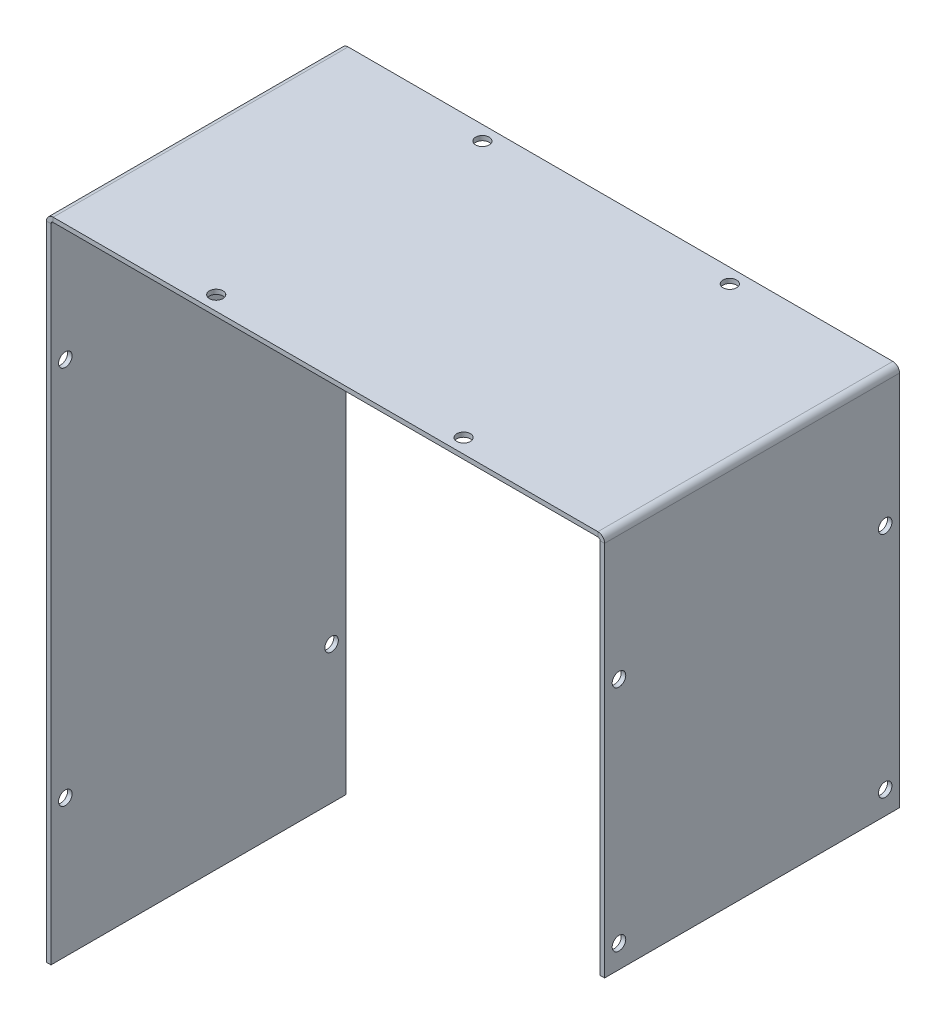
ISO-10303-21;
HEADER;
FILE_DESCRIPTION(('STEP AP214'),'2;1');
FILE_NAME('part.step','',(''),(''),'','','');
FILE_SCHEMA(('AUTOMOTIVE_DESIGN { 1 0 10303 214 1 1 1 1 }'));
ENDSEC;
DATA;
#1=APPLICATION_CONTEXT('core data for automotive mechanical design processes');
#2=APPLICATION_PROTOCOL_DEFINITION('international standard','automotive_design',2000,#1);
#3=PRODUCT_CONTEXT('',#1,'mechanical');
#4=PRODUCT('Part','Part','',(#3));
#5=PRODUCT_RELATED_PRODUCT_CATEGORY('part','',(#4));
#6=PRODUCT_DEFINITION_FORMATION('','',#4);
#7=PRODUCT_DEFINITION_CONTEXT('part definition',#1,'design');
#8=PRODUCT_DEFINITION('design','',#6,#7);
#9=PRODUCT_DEFINITION_SHAPE('','',#8);
#10=(LENGTH_UNIT() NAMED_UNIT(*) SI_UNIT(.MILLI.,.METRE.));
#11=(NAMED_UNIT(*) PLANE_ANGLE_UNIT() SI_UNIT($,.RADIAN.));
#12=(NAMED_UNIT(*) SI_UNIT($,.STERADIAN.) SOLID_ANGLE_UNIT());
#13=UNCERTAINTY_MEASURE_WITH_UNIT(LENGTH_MEASURE(1.E-05),#10,'distance_accuracy_value','');
#14=(GEOMETRIC_REPRESENTATION_CONTEXT(3) GLOBAL_UNCERTAINTY_ASSIGNED_CONTEXT((#13)) GLOBAL_UNIT_ASSIGNED_CONTEXT((#10,
#11,#12)) REPRESENTATION_CONTEXT('',''));
#15=CARTESIAN_POINT('',(0.,0.,0.));
#16=DIRECTION('',(0.,0.,1.));
#17=DIRECTION('',(1.,0.,0.));
#18=AXIS2_PLACEMENT_3D('',#15,#16,#17);
#19=CARTESIAN_POINT('',(-14.2238489831898,123.556300962878,91.5365107004053));
#20=DIRECTION('',(0.,0.,-1.));
#21=DIRECTION('',(0.,1.,0.));
#22=AXIS2_PLACEMENT_3D('',#19,#20,#21);
#23=PLANE('',#22);
#24=DIRECTION('',(0.,1.,0.));
#25=VECTOR('',#24,1.);
#26=CARTESIAN_POINT('',(167.03955101681,122.056300962877,91.5365107004056));
#27=LINE('',#26,#25);
#28=CARTESIAN_POINT('',(167.03955101681,122.056300962877,91.5365107004056));
#29=VERTEX_POINT('',#28);
#30=CARTESIAN_POINT('',(167.03955101681,123.556300962877,91.5365107004056));
#31=VERTEX_POINT('',#30);
#32=EDGE_CURVE('E163',#29,#31,#27,.T.);
#33=ORIENTED_EDGE('',*,*,#32,.T.);
#34=DIRECTION('',(1.,0.,0.));
#35=VECTOR('',#34,1.);
#36=CARTESIAN_POINT('',(-14.2238489831898,123.556300962878,91.5365107004053));
#37=LINE('',#36,#35);
#38=CARTESIAN_POINT('',(-13.4872489831898,123.556300962878,91.5365107004053));
#39=VERTEX_POINT('',#38);
#40=EDGE_CURVE('E40',#39,#31,#37,.T.);
#41=ORIENTED_EDGE('',*,*,#40,.F.);
#42=DIRECTION('',(0.,1.,0.));
#43=VECTOR('',#42,1.);
#44=CARTESIAN_POINT('',(-13.4872489831898,122.056300962877,91.5365107004052));
#45=LINE('',#44,#43);
#46=CARTESIAN_POINT('',(-13.4872489831898,122.056300962877,91.5365107004052));
#47=VERTEX_POINT('',#46);
#48=EDGE_CURVE('E224',#47,#39,#45,.T.);
#49=ORIENTED_EDGE('',*,*,#48,.F.);
#50=DIRECTION('',(1.,0.,0.));
#51=VECTOR('',#50,1.);
#52=CARTESIAN_POINT('',(-14.2238489831898,122.056300962878,91.5365107004053));
#53=LINE('',#52,#51);
#54=EDGE_CURVE('E226',#47,#29,#53,.T.);
#55=ORIENTED_EDGE('',*,*,#54,.T.);
#56=EDGE_LOOP('',(#33,#41,#49,#55));
#57=FACE_BOUND('',#56,.T.);
#58=ADVANCED_FACE('F32',(#57),#23,.F.);
#59=CARTESIAN_POINT('',(-14.2238489831898,123.556300962877,-6.22688929959475));
#60=DIRECTION('',(0.,0.,1.));
#61=DIRECTION('',(0.,-1.,0.));
#62=AXIS2_PLACEMENT_3D('',#59,#60,#61);
#63=PLANE('',#62);
#64=DIRECTION('',(0.,1.,0.));
#65=VECTOR('',#64,1.);
#66=CARTESIAN_POINT('',(167.03955101681,122.056300962877,-6.22688929959481));
#67=LINE('',#66,#65);
#68=CARTESIAN_POINT('',(167.03955101681,122.056300962877,-6.22688929959481));
#69=VERTEX_POINT('',#68);
#70=CARTESIAN_POINT('',(167.03955101681,123.556300962877,-6.22688929959481));
#71=VERTEX_POINT('',#70);
#72=EDGE_CURVE('E173',#69,#71,#67,.T.);
#73=ORIENTED_EDGE('',*,*,#72,.F.);
#74=DIRECTION('',(-1.,0.,0.));
#75=VECTOR('',#74,1.);
#76=CARTESIAN_POINT('',(-14.2238489831898,122.056300962877,-6.22688929959474));
#77=LINE('',#76,#75);
#78=CARTESIAN_POINT('',(-13.4872489831898,122.056300962877,-6.22688929959418));
#79=VERTEX_POINT('',#78);
#80=EDGE_CURVE('E35',#69,#79,#77,.T.);
#81=ORIENTED_EDGE('',*,*,#80,.T.);
#82=DIRECTION('',(0.,1.,0.));
#83=VECTOR('',#82,1.);
#84=CARTESIAN_POINT('',(-13.4872489831898,122.056300962877,-6.22688929959418));
#85=LINE('',#84,#83);
#86=CARTESIAN_POINT('',(-13.4872489831898,123.556300962877,-6.22688929959418));
#87=VERTEX_POINT('',#86);
#88=EDGE_CURVE('E214',#79,#87,#85,.T.);
#89=ORIENTED_EDGE('',*,*,#88,.T.);
#90=DIRECTION('',(-1.,0.,0.));
#91=VECTOR('',#90,1.);
#92=CARTESIAN_POINT('',(-14.2238489831898,123.556300962877,-6.22688929959475));
#93=LINE('',#92,#91);
#94=EDGE_CURVE('E11',#71,#87,#93,.T.);
#95=ORIENTED_EDGE('',*,*,#94,.F.);
#96=EDGE_LOOP('',(#73,#81,#89,#95));
#97=FACE_BOUND('',#96,.T.);
#98=ADVANCED_FACE('F238',(#97),#63,.F.);
#99=CARTESIAN_POINT('',(-14.2238489831898,123.556300962878,91.5365107004053));
#100=DIRECTION('',(0.,1.,0.));
#101=DIRECTION('',(0.,0.,1.));
#102=AXIS2_PLACEMENT_3D('',#99,#100,#101);
#103=PLANE('',#102);
#104=CARTESIAN_POINT('',(35.7761510168102,123.556300962877,-1.46348929959506));
#105=DIRECTION('',(0.,1.,0.));
#106=DIRECTION('',(0.,0.,1.));
#107=AXIS2_PLACEMENT_3D('',#104,#105,#106);
#108=CIRCLE('',#107,2.24999999999999);
#109=CARTESIAN_POINT('',(35.7761510168102,123.556300962877,0.786510700404926));
#110=VERTEX_POINT('',#109);
#111=EDGE_CURVE('E502',#110,#110,#108,.T.);
#112=ORIENTED_EDGE('',*,*,#111,.F.);
#113=EDGE_LOOP('',(#112));
#114=FACE_BOUND('',#113,.T.);
#115=CARTESIAN_POINT('',(117.77615101681,123.556300962877,-1.46348929959506));
#116=DIRECTION('',(0.,1.,0.));
#117=DIRECTION('',(0.,0.,1.));
#118=AXIS2_PLACEMENT_3D('',#115,#116,#117);
#119=CIRCLE('',#118,2.24999999999999);
#120=CARTESIAN_POINT('',(117.77615101681,123.556300962877,0.786510700404926));
#121=VERTEX_POINT('',#120);
#122=EDGE_CURVE('E496',#121,#121,#119,.T.);
#123=ORIENTED_EDGE('',*,*,#122,.F.);
#124=EDGE_LOOP('',(#123));
#125=FACE_BOUND('',#124,.T.);
#126=CARTESIAN_POINT('',(117.77615101681,123.556300962877,86.7731107004049));
#127=DIRECTION('',(0.,1.,0.));
#128=DIRECTION('',(0.,0.,1.));
#129=AXIS2_PLACEMENT_3D('',#126,#127,#128);
#130=CIRCLE('',#129,2.24999999999999);
#131=CARTESIAN_POINT('',(117.77615101681,123.556300962877,89.0231107004049));
#132=VERTEX_POINT('',#131);
#133=EDGE_CURVE('E490',#132,#132,#130,.T.);
#134=ORIENTED_EDGE('',*,*,#133,.F.);
#135=EDGE_LOOP('',(#134));
#136=FACE_BOUND('',#135,.T.);
#137=CARTESIAN_POINT('',(35.7761510168102,123.556300962877,86.7731107004049));
#138=DIRECTION('',(0.,1.,0.));
#139=DIRECTION('',(0.,0.,1.));
#140=AXIS2_PLACEMENT_3D('',#137,#138,#139);
#141=CIRCLE('',#140,2.24999999999999);
#142=CARTESIAN_POINT('',(35.7761510168102,123.556300962877,89.0231107004049));
#143=VERTEX_POINT('',#142);
#144=EDGE_CURVE('E484',#143,#143,#141,.T.);
#145=ORIENTED_EDGE('',*,*,#144,.F.);
#146=EDGE_LOOP('',(#145));
#147=FACE_BOUND('',#146,.T.);
#148=ORIENTED_EDGE('',*,*,#40,.T.);
#149=DIRECTION('',(0.,0.,1.));
#150=VECTOR('',#149,1.);
#151=CARTESIAN_POINT('',(167.03955101681,123.556300962877,91.5365107004056));
#152=LINE('',#151,#150);
#153=EDGE_CURVE('E158',#31,#71,#152,.F.);
#154=ORIENTED_EDGE('',*,*,#153,.T.);
#155=ORIENTED_EDGE('',*,*,#94,.T.);
#156=DIRECTION('',(0.,0.,-1.));
#157=VECTOR('',#156,1.);
#158=CARTESIAN_POINT('',(-13.4872489831898,123.556300962877,-6.22688929959474));
#159=LINE('',#158,#157);
#160=EDGE_CURVE('E209',#87,#39,#159,.F.);
#161=ORIENTED_EDGE('',*,*,#160,.T.);
#162=EDGE_LOOP('',(#148,#154,#155,#161));
#163=FACE_BOUND('',#162,.T.);
#164=ADVANCED_FACE('F256',(#114,#125,#136,#147,#163),#103,.T.);
#165=CARTESIAN_POINT('',(-14.2238489831898,122.056300962878,91.5365107004053));
#166=DIRECTION('',(0.,1.,0.));
#167=DIRECTION('',(0.,0.,1.));
#168=AXIS2_PLACEMENT_3D('',#165,#166,#167);
#169=PLANE('',#168);
#170=CARTESIAN_POINT('',(35.7761510168102,122.056300962877,-1.46348929959506));
#171=DIRECTION('',(0.,1.,0.));
#172=DIRECTION('',(0.,0.,1.));
#173=AXIS2_PLACEMENT_3D('',#170,#171,#172);
#174=CIRCLE('',#173,2.25);
#175=CARTESIAN_POINT('',(35.7761510168102,122.056300962877,0.786510700404937));
#176=VERTEX_POINT('',#175);
#177=EDGE_CURVE('E499',#176,#176,#174,.T.);
#178=ORIENTED_EDGE('',*,*,#177,.T.);
#179=EDGE_LOOP('',(#178));
#180=FACE_BOUND('',#179,.T.);
#181=CARTESIAN_POINT('',(117.77615101681,122.056300962877,-1.46348929959506));
#182=DIRECTION('',(0.,1.,0.));
#183=DIRECTION('',(0.,0.,1.));
#184=AXIS2_PLACEMENT_3D('',#181,#182,#183);
#185=CIRCLE('',#184,2.25);
#186=CARTESIAN_POINT('',(117.77615101681,122.056300962877,0.786510700404937));
#187=VERTEX_POINT('',#186);
#188=EDGE_CURVE('E493',#187,#187,#185,.T.);
#189=ORIENTED_EDGE('',*,*,#188,.T.);
#190=EDGE_LOOP('',(#189));
#191=FACE_BOUND('',#190,.T.);
#192=CARTESIAN_POINT('',(117.77615101681,122.056300962878,86.7731107004049));
#193=DIRECTION('',(0.,1.,0.));
#194=DIRECTION('',(0.,0.,1.));
#195=AXIS2_PLACEMENT_3D('',#192,#193,#194);
#196=CIRCLE('',#195,2.25);
#197=CARTESIAN_POINT('',(117.77615101681,122.056300962878,89.0231107004049));
#198=VERTEX_POINT('',#197);
#199=EDGE_CURVE('E487',#198,#198,#196,.T.);
#200=ORIENTED_EDGE('',*,*,#199,.T.);
#201=EDGE_LOOP('',(#200));
#202=FACE_BOUND('',#201,.T.);
#203=CARTESIAN_POINT('',(35.7761510168102,122.056300962878,86.7731107004049));
#204=DIRECTION('',(0.,1.,0.));
#205=DIRECTION('',(0.,0.,1.));
#206=AXIS2_PLACEMENT_3D('',#203,#204,#205);
#207=CIRCLE('',#206,2.25);
#208=CARTESIAN_POINT('',(35.7761510168102,122.056300962878,89.0231107004049));
#209=VERTEX_POINT('',#208);
#210=EDGE_CURVE('E481',#209,#209,#207,.T.);
#211=ORIENTED_EDGE('',*,*,#210,.T.);
#212=EDGE_LOOP('',(#211));
#213=FACE_BOUND('',#212,.T.);
#214=DIRECTION('',(0.,0.,1.));
#215=VECTOR('',#214,1.);
#216=CARTESIAN_POINT('',(167.03955101681,122.056300962877,91.5365107004056));
#217=LINE('',#216,#215);
#218=EDGE_CURVE('E169',#29,#69,#217,.F.);
#219=ORIENTED_EDGE('',*,*,#218,.F.);
#220=ORIENTED_EDGE('',*,*,#54,.F.);
#221=DIRECTION('',(0.,0.,-1.));
#222=VECTOR('',#221,1.);
#223=CARTESIAN_POINT('',(-13.4872489831898,122.056300962877,-6.22688929959474));
#224=LINE('',#223,#222);
#225=EDGE_CURVE('E220',#79,#47,#224,.F.);
#226=ORIENTED_EDGE('',*,*,#225,.F.);
#227=ORIENTED_EDGE('',*,*,#80,.F.);
#228=EDGE_LOOP('',(#219,#220,#226,#227));
#229=FACE_BOUND('',#228,.T.);
#230=ADVANCED_FACE('F251',(#180,#191,#202,#213,#229),#169,.F.);
#231=CARTESIAN_POINT('',(-13.4872489831898,121.319700962877,91.5365107004052));
#232=DIRECTION('',(0.,0.,1.));
#233=DIRECTION('',(1.,0.,0.));
#234=AXIS2_PLACEMENT_3D('',#231,#232,#233);
#235=PLANE('',#234);
#236=DIRECTION('',(-1.,0.,0.));
#237=VECTOR('',#236,1.);
#238=CARTESIAN_POINT('',(-14.2238489831898,121.319700962878,91.5365107004058));
#239=LINE('',#238,#237);
#240=CARTESIAN_POINT('',(-14.2238489831898,121.319700962877,91.5365107004052));
#241=VERTEX_POINT('',#240);
#242=CARTESIAN_POINT('',(-15.7238489831898,121.319700962877,91.5365107004052));
#243=VERTEX_POINT('',#242);
#244=EDGE_CURVE('E175',#241,#243,#239,.T.);
#245=ORIENTED_EDGE('',*,*,#244,.F.);
#246=CARTESIAN_POINT('',(-13.4872489831898,121.319700962877,91.5365107004052));
#247=DIRECTION('',(0.,0.,-1.));
#248=DIRECTION('',(-1.,0.,0.));
#249=AXIS2_PLACEMENT_3D('',#246,#247,#248);
#250=CIRCLE('',#249,0.736600000000002);
#251=EDGE_CURVE('E217',#47,#241,#250,.F.);
#252=ORIENTED_EDGE('',*,*,#251,.F.);
#253=ORIENTED_EDGE('',*,*,#48,.T.);
#254=CARTESIAN_POINT('',(-13.4872489831898,121.319700962877,91.5365107004052));
#255=DIRECTION('',(0.,0.,-1.));
#256=DIRECTION('',(-1.,0.,0.));
#257=AXIS2_PLACEMENT_3D('',#254,#255,#256);
#258=CIRCLE('',#257,2.2366);
#259=EDGE_CURVE('E56',#39,#243,#258,.F.);
#260=ORIENTED_EDGE('',*,*,#259,.T.);
#261=EDGE_LOOP('',(#245,#252,#253,#260));
#262=FACE_BOUND('',#261,.T.);
#263=ADVANCED_FACE('F254',(#262),#235,.T.);
#264=CARTESIAN_POINT('',(-13.4872489831898,121.319700962877,-6.22688929959418));
#265=DIRECTION('',(0.,0.,1.));
#266=DIRECTION('',(1.,0.,0.));
#267=AXIS2_PLACEMENT_3D('',#264,#265,#266);
#268=PLANE('',#267);
#269=CARTESIAN_POINT('',(-13.4872489831898,121.319700962877,-6.22688929959418));
#270=DIRECTION('',(0.,0.,-1.));
#271=DIRECTION('',(-1.,0.,0.));
#272=AXIS2_PLACEMENT_3D('',#269,#270,#271);
#273=CIRCLE('',#272,0.736600000000002);
#274=CARTESIAN_POINT('',(-14.2238489831898,121.319700962877,-6.22688929959418));
#275=VERTEX_POINT('',#274);
#276=EDGE_CURVE('E208',#275,#79,#273,.T.);
#277=ORIENTED_EDGE('',*,*,#276,.F.);
#278=DIRECTION('',(-1.,0.,0.));
#279=VECTOR('',#278,1.);
#280=CARTESIAN_POINT('',(-14.2238489831898,121.319700962877,-6.22688929959418));
#281=LINE('',#280,#279);
#282=CARTESIAN_POINT('',(-15.7238489831898,121.319700962877,-6.22688929959474));
#283=VERTEX_POINT('',#282);
#284=EDGE_CURVE('E180',#275,#283,#281,.T.);
#285=ORIENTED_EDGE('',*,*,#284,.T.);
#286=CARTESIAN_POINT('',(-13.4872489831898,121.319700962877,-6.22688929959418));
#287=DIRECTION('',(0.,0.,-1.));
#288=DIRECTION('',(-1.,0.,0.));
#289=AXIS2_PLACEMENT_3D('',#286,#287,#288);
#290=CIRCLE('',#289,2.2366);
#291=EDGE_CURVE('E212',#283,#87,#290,.T.);
#292=ORIENTED_EDGE('',*,*,#291,.T.);
#293=ORIENTED_EDGE('',*,*,#88,.F.);
#294=EDGE_LOOP('',(#277,#285,#292,#293));
#295=FACE_BOUND('',#294,.T.);
#296=ADVANCED_FACE('F245',(#295),#268,.F.);
#297=CARTESIAN_POINT('',(-13.4872489831898,121.319700962877,-6.22688929959474));
#298=DIRECTION('',(0.,0.,-1.));
#299=DIRECTION('',(-1.,0.,0.));
#300=AXIS2_PLACEMENT_3D('',#297,#298,#299);
#301=CYLINDRICAL_SURFACE('',#300,2.2366);
#302=ORIENTED_EDGE('',*,*,#160,.F.);
#303=ORIENTED_EDGE('',*,*,#291,.F.);
#304=DIRECTION('',(0.,0.,-1.));
#305=VECTOR('',#304,1.);
#306=CARTESIAN_POINT('',(-15.7238489831898,121.319700962878,91.5365107004053));
#307=LINE('',#306,#305);
#308=EDGE_CURVE('E183',#243,#283,#307,.T.);
#309=ORIENTED_EDGE('',*,*,#308,.F.);
#310=ORIENTED_EDGE('',*,*,#259,.F.);
#311=EDGE_LOOP('',(#302,#303,#309,#310));
#312=FACE_BOUND('',#311,.T.);
#313=ADVANCED_FACE('F257',(#312),#301,.T.);
#314=CARTESIAN_POINT('',(-13.4872489831898,121.319700962877,-6.22688929959474));
#315=DIRECTION('',(0.,0.,-1.));
#316=DIRECTION('',(-1.,0.,0.));
#317=AXIS2_PLACEMENT_3D('',#314,#315,#316);
#318=CYLINDRICAL_SURFACE('',#317,0.736600000000002);
#319=ORIENTED_EDGE('',*,*,#225,.T.);
#320=ORIENTED_EDGE('',*,*,#251,.T.);
#321=DIRECTION('',(0.,0.,-1.));
#322=VECTOR('',#321,1.);
#323=CARTESIAN_POINT('',(-14.2238489831898,121.319700962878,91.5365107004058));
#324=LINE('',#323,#322);
#325=EDGE_CURVE('E178',#241,#275,#324,.T.);
#326=ORIENTED_EDGE('',*,*,#325,.T.);
#327=ORIENTED_EDGE('',*,*,#276,.T.);
#328=EDGE_LOOP('',(#319,#320,#326,#327));
#329=FACE_BOUND('',#328,.T.);
#330=ADVANCED_FACE('F248',(#329),#318,.F.);
#331=CARTESIAN_POINT('',(-15.7238489831898,122.056300962877,-6.22688929959474));
#332=DIRECTION('',(0.,0.,1.));
#333=DIRECTION('',(0.,-1.,0.));
#334=AXIS2_PLACEMENT_3D('',#331,#332,#333);
#335=PLANE('',#334);
#336=ORIENTED_EDGE('',*,*,#284,.F.);
#337=DIRECTION('',(0.,-1.,0.));
#338=VECTOR('',#337,1.);
#339=CARTESIAN_POINT('',(-14.2238489831898,122.056300962877,-6.22688929959474));
#340=LINE('',#339,#338);
#341=CARTESIAN_POINT('',(-14.2238489831906,-91.4436990371231,-6.22688929959362));
#342=VERTEX_POINT('',#341);
#343=EDGE_CURVE('E188',#275,#342,#340,.T.);
#344=ORIENTED_EDGE('',*,*,#343,.T.);
#345=DIRECTION('',(1.,0.,0.));
#346=VECTOR('',#345,1.);
#347=CARTESIAN_POINT('',(-15.7238489831906,-91.4436990371231,-6.22688929959362));
#348=LINE('',#347,#346);
#349=CARTESIAN_POINT('',(-15.7238489831906,-91.4436990371231,-6.22688929959362));
#350=VERTEX_POINT('',#349);
#351=EDGE_CURVE('E205',#350,#342,#348,.T.);
#352=ORIENTED_EDGE('',*,*,#351,.F.);
#353=DIRECTION('',(0.,-1.,0.));
#354=VECTOR('',#353,1.);
#355=CARTESIAN_POINT('',(-15.7238489831898,122.056300962877,-6.22688929959474));
#356=LINE('',#355,#354);
#357=EDGE_CURVE('E189',#283,#350,#356,.T.);
#358=ORIENTED_EDGE('',*,*,#357,.F.);
#359=EDGE_LOOP('',(#336,#344,#352,#358));
#360=FACE_BOUND('',#359,.T.);
#361=ADVANCED_FACE('F265',(#360),#335,.F.);
#362=CARTESIAN_POINT('',(-15.7238489831906,-91.4436990371226,91.5365107004063));
#363=DIRECTION('',(0.,0.,-1.));
#364=DIRECTION('',(0.,1.,0.));
#365=AXIS2_PLACEMENT_3D('',#362,#363,#364);
#366=PLANE('',#365);
#367=ORIENTED_EDGE('',*,*,#244,.T.);
#368=DIRECTION('',(0.,1.,0.));
#369=VECTOR('',#368,1.);
#370=CARTESIAN_POINT('',(-15.7238489831906,-91.4436990371226,91.5365107004063));
#371=LINE('',#370,#369);
#372=CARTESIAN_POINT('',(-15.7238489831906,-91.4436990371226,91.5365107004063));
#373=VERTEX_POINT('',#372);
#374=EDGE_CURVE('E194',#373,#243,#371,.T.);
#375=ORIENTED_EDGE('',*,*,#374,.F.);
#376=DIRECTION('',(1.,0.,0.));
#377=VECTOR('',#376,1.);
#378=CARTESIAN_POINT('',(-15.7238489831906,-91.4436990371226,91.5365107004063));
#379=LINE('',#378,#377);
#380=CARTESIAN_POINT('',(-14.2238489831906,-91.4436990371226,91.5365107004063));
#381=VERTEX_POINT('',#380);
#382=EDGE_CURVE('E197',#373,#381,#379,.T.);
#383=ORIENTED_EDGE('',*,*,#382,.T.);
#384=DIRECTION('',(0.,1.,0.));
#385=VECTOR('',#384,1.);
#386=CARTESIAN_POINT('',(-14.2238489831906,-91.4436990371226,91.5365107004063));
#387=LINE('',#386,#385);
#388=EDGE_CURVE('E192',#381,#241,#387,.T.);
#389=ORIENTED_EDGE('',*,*,#388,.T.);
#390=EDGE_LOOP('',(#367,#375,#383,#389));
#391=FACE_BOUND('',#390,.T.);
#392=ADVANCED_FACE('F273',(#391),#366,.F.);
#393=CARTESIAN_POINT('',(-15.7238489831898,122.056300962878,91.5365107004053));
#394=DIRECTION('',(-1.,0.,0.));
#395=DIRECTION('',(0.,-1.,0.));
#396=AXIS2_PLACEMENT_3D('',#393,#394,#395);
#397=PLANE('',#396);
#398=CARTESIAN_POINT('',(-15.72384898319,79.8491941816911,-1.4634892995947));
#399=DIRECTION('',(-1.,0.,0.));
#400=DIRECTION('',(0.,0.,1.));
#401=AXIS2_PLACEMENT_3D('',#398,#399,#400);
#402=CIRCLE('',#401,2.24999999999999);
#403=CARTESIAN_POINT('',(-15.72384898319,79.8491941816911,0.786510700405283));
#404=VERTEX_POINT('',#403);
#405=EDGE_CURVE('E525',#404,#404,#402,.T.);
#406=ORIENTED_EDGE('',*,*,#405,.F.);
#407=EDGE_LOOP('',(#406));
#408=FACE_BOUND('',#407,.T.);
#409=CARTESIAN_POINT('',(-15.72384898319,79.9457941816919,86.7731107004053));
#410=DIRECTION('',(-1.,0.,0.));
#411=DIRECTION('',(0.,0.,1.));
#412=AXIS2_PLACEMENT_3D('',#409,#410,#411);
#413=CIRCLE('',#412,2.24999999999999);
#414=CARTESIAN_POINT('',(-15.72384898319,79.9457941816919,89.0231107004053));
#415=VERTEX_POINT('',#414);
#416=EDGE_CURVE('E520',#415,#415,#413,.T.);
#417=ORIENTED_EDGE('',*,*,#416,.F.);
#418=EDGE_LOOP('',(#417));
#419=FACE_BOUND('',#418,.T.);
#420=CARTESIAN_POINT('',(-15.7238489831904,-45.8436990371223,86.7731107004053));
#421=DIRECTION('',(-1.,0.,0.));
#422=DIRECTION('',(0.,0.,1.));
#423=AXIS2_PLACEMENT_3D('',#420,#421,#422);
#424=CIRCLE('',#423,2.24999999999999);
#425=CARTESIAN_POINT('',(-15.7238489831904,-45.8436990371223,89.0231107004053));
#426=VERTEX_POINT('',#425);
#427=EDGE_CURVE('E514',#426,#426,#424,.T.);
#428=ORIENTED_EDGE('',*,*,#427,.F.);
#429=EDGE_LOOP('',(#428));
#430=FACE_BOUND('',#429,.T.);
#431=CARTESIAN_POINT('',(-15.7238489831904,-45.8436990371223,-1.46348929959473));
#432=DIRECTION('',(-1.,0.,0.));
#433=DIRECTION('',(0.,0.,1.));
#434=AXIS2_PLACEMENT_3D('',#431,#432,#433);
#435=CIRCLE('',#434,2.24999999999999);
#436=CARTESIAN_POINT('',(-15.7238489831904,-45.8436990371223,0.786510700405258));
#437=VERTEX_POINT('',#436);
#438=EDGE_CURVE('E508',#437,#437,#435,.T.);
#439=ORIENTED_EDGE('',*,*,#438,.F.);
#440=EDGE_LOOP('',(#439));
#441=FACE_BOUND('',#440,.T.);
#442=ORIENTED_EDGE('',*,*,#374,.T.);
#443=ORIENTED_EDGE('',*,*,#308,.T.);
#444=ORIENTED_EDGE('',*,*,#357,.T.);
#445=DIRECTION('',(0.,0.,1.));
#446=VECTOR('',#445,1.);
#447=CARTESIAN_POINT('',(-15.7238489831906,-91.4436990371231,-6.22688929959362));
#448=LINE('',#447,#446);
#449=EDGE_CURVE('E191',#350,#373,#448,.T.);
#450=ORIENTED_EDGE('',*,*,#449,.T.);
#451=EDGE_LOOP('',(#442,#443,#444,#450));
#452=FACE_BOUND('',#451,.T.);
#453=ADVANCED_FACE('F262',(#408,#419,#430,#441,#452),#397,.T.);
#454=CARTESIAN_POINT('',(-14.2238489831898,122.056300962878,91.5365107004053));
#455=DIRECTION('',(-1.,0.,0.));
#456=DIRECTION('',(0.,-1.,0.));
#457=AXIS2_PLACEMENT_3D('',#454,#455,#456);
#458=PLANE('',#457);
#459=CARTESIAN_POINT('',(-14.22384898319,79.8491941816911,-1.4634892995947));
#460=DIRECTION('',(-1.,0.,0.));
#461=DIRECTION('',(0.,-1.,0.));
#462=AXIS2_PLACEMENT_3D('',#459,#460,#461);
#463=CIRCLE('',#462,2.25);
#464=CARTESIAN_POINT('',(-14.22384898319,77.5991941816911,-1.4634892995947));
#465=VERTEX_POINT('',#464);
#466=EDGE_CURVE('E523',#465,#465,#463,.T.);
#467=ORIENTED_EDGE('',*,*,#466,.T.);
#468=EDGE_LOOP('',(#467));
#469=FACE_BOUND('',#468,.T.);
#470=CARTESIAN_POINT('',(-14.22384898319,79.9457941816919,86.7731107004053));
#471=DIRECTION('',(-1.,0.,0.));
#472=DIRECTION('',(0.,-1.,0.));
#473=AXIS2_PLACEMENT_3D('',#470,#471,#472);
#474=CIRCLE('',#473,2.25);
#475=CARTESIAN_POINT('',(-14.22384898319,77.6957941816919,86.7731107004053));
#476=VERTEX_POINT('',#475);
#477=EDGE_CURVE('E517',#476,#476,#474,.T.);
#478=ORIENTED_EDGE('',*,*,#477,.T.);
#479=EDGE_LOOP('',(#478));
#480=FACE_BOUND('',#479,.T.);
#481=CARTESIAN_POINT('',(-14.2238489831904,-45.8436990371223,86.7731107004053));
#482=DIRECTION('',(-1.,0.,0.));
#483=DIRECTION('',(0.,-1.,0.));
#484=AXIS2_PLACEMENT_3D('',#481,#482,#483);
#485=CIRCLE('',#484,2.25);
#486=CARTESIAN_POINT('',(-14.2238489831904,-48.0936990371223,86.7731107004053));
#487=VERTEX_POINT('',#486);
#488=EDGE_CURVE('E511',#487,#487,#485,.T.);
#489=ORIENTED_EDGE('',*,*,#488,.T.);
#490=EDGE_LOOP('',(#489));
#491=FACE_BOUND('',#490,.T.);
#492=CARTESIAN_POINT('',(-14.2238489831904,-45.8436990371223,-1.46348929959473));
#493=DIRECTION('',(-1.,0.,0.));
#494=DIRECTION('',(0.,-1.,0.));
#495=AXIS2_PLACEMENT_3D('',#492,#493,#494);
#496=CIRCLE('',#495,2.25);
#497=CARTESIAN_POINT('',(-14.2238489831904,-48.0936990371223,-1.46348929959473));
#498=VERTEX_POINT('',#497);
#499=EDGE_CURVE('E505',#498,#498,#496,.T.);
#500=ORIENTED_EDGE('',*,*,#499,.T.);
#501=EDGE_LOOP('',(#500));
#502=FACE_BOUND('',#501,.T.);
#503=ORIENTED_EDGE('',*,*,#325,.F.);
#504=ORIENTED_EDGE('',*,*,#388,.F.);
#505=DIRECTION('',(0.,0.,1.));
#506=VECTOR('',#505,1.);
#507=CARTESIAN_POINT('',(-14.2238489831906,-91.4436990371231,-6.22688929959362));
#508=LINE('',#507,#506);
#509=EDGE_CURVE('E199',#342,#381,#508,.T.);
#510=ORIENTED_EDGE('',*,*,#509,.F.);
#511=ORIENTED_EDGE('',*,*,#343,.F.);
#512=EDGE_LOOP('',(#503,#504,#510,#511));
#513=FACE_BOUND('',#512,.T.);
#514=ADVANCED_FACE('F275',(#469,#480,#491,#502,#513),#458,.F.);
#515=CARTESIAN_POINT('',(-15.7238489831906,-91.4436990371231,-6.22688929959362));
#516=DIRECTION('',(0.,1.,0.));
#517=DIRECTION('',(0.,0.,1.));
#518=AXIS2_PLACEMENT_3D('',#515,#516,#517);
#519=PLANE('',#518);
#520=ORIENTED_EDGE('',*,*,#509,.T.);
#521=ORIENTED_EDGE('',*,*,#382,.F.);
#522=ORIENTED_EDGE('',*,*,#449,.F.);
#523=ORIENTED_EDGE('',*,*,#351,.T.);
#524=EDGE_LOOP('',(#520,#521,#522,#523));
#525=FACE_BOUND('',#524,.T.);
#526=ADVANCED_FACE('F270',(#525),#519,.F.);
#527=CARTESIAN_POINT('',(167.03955101681,121.319700962877,-6.22688929959481));
#528=DIRECTION('',(0.,0.,-1.));
#529=DIRECTION('',(-1.,0.,0.));
#530=AXIS2_PLACEMENT_3D('',#527,#528,#529);
#531=PLANE('',#530);
#532=DIRECTION('',(1.,0.,0.));
#533=VECTOR('',#532,1.);
#534=CARTESIAN_POINT('',(167.77615101681,121.319700962877,-6.22688929959446));
#535=LINE('',#534,#533);
#536=CARTESIAN_POINT('',(167.77615101681,121.319700962877,-6.22688929959481));
#537=VERTEX_POINT('',#536);
#538=CARTESIAN_POINT('',(169.27615101681,121.319700962877,-6.22688929959481));
#539=VERTEX_POINT('',#538);
#540=EDGE_CURVE('E450',#537,#539,#535,.T.);
#541=ORIENTED_EDGE('',*,*,#540,.F.);
#542=CARTESIAN_POINT('',(167.03955101681,121.319700962877,-6.22688929959481));
#543=DIRECTION('',(0.,0.,1.));
#544=DIRECTION('',(1.,0.,0.));
#545=AXIS2_PLACEMENT_3D('',#542,#543,#544);
#546=CIRCLE('',#545,0.736600000000004);
#547=EDGE_CURVE('E166',#69,#537,#546,.F.);
#548=ORIENTED_EDGE('',*,*,#547,.F.);
#549=ORIENTED_EDGE('',*,*,#72,.T.);
#550=CARTESIAN_POINT('',(167.03955101681,121.319700962877,-6.22688929959481));
#551=DIRECTION('',(0.,0.,1.));
#552=DIRECTION('',(1.,0.,0.));
#553=AXIS2_PLACEMENT_3D('',#550,#551,#552);
#554=CIRCLE('',#553,2.2366);
#555=EDGE_CURVE('E48',#71,#539,#554,.F.);
#556=ORIENTED_EDGE('',*,*,#555,.T.);
#557=EDGE_LOOP('',(#541,#548,#549,#556));
#558=FACE_BOUND('',#557,.T.);
#559=ADVANCED_FACE('F283',(#558),#531,.T.);
#560=CARTESIAN_POINT('',(167.03955101681,121.319700962877,91.5365107004056));
#561=DIRECTION('',(0.,0.,-1.));
#562=DIRECTION('',(-1.,0.,0.));
#563=AXIS2_PLACEMENT_3D('',#560,#561,#562);
#564=PLANE('',#563);
#565=CARTESIAN_POINT('',(167.03955101681,121.319700962877,91.5365107004056));
#566=DIRECTION('',(0.,0.,1.));
#567=DIRECTION('',(1.,0.,0.));
#568=AXIS2_PLACEMENT_3D('',#565,#566,#567);
#569=CIRCLE('',#568,0.736600000000004);
#570=CARTESIAN_POINT('',(167.77615101681,121.319700962877,91.5365107004056));
#571=VERTEX_POINT('',#570);
#572=EDGE_CURVE('E141',#571,#29,#569,.T.);
#573=ORIENTED_EDGE('',*,*,#572,.F.);
#574=DIRECTION('',(1.,0.,0.));
#575=VECTOR('',#574,1.);
#576=CARTESIAN_POINT('',(167.77615101681,121.319700962878,91.5365107004056));
#577=LINE('',#576,#575);
#578=CARTESIAN_POINT('',(169.27615101681,121.319700962877,91.5365107004053));
#579=VERTEX_POINT('',#578);
#580=EDGE_CURVE('E444',#571,#579,#577,.T.);
#581=ORIENTED_EDGE('',*,*,#580,.T.);
#582=CARTESIAN_POINT('',(167.03955101681,121.319700962877,91.5365107004056));
#583=DIRECTION('',(0.,0.,1.));
#584=DIRECTION('',(1.,0.,0.));
#585=AXIS2_PLACEMENT_3D('',#582,#583,#584);
#586=CIRCLE('',#585,2.2366);
#587=EDGE_CURVE('E161',#579,#31,#586,.T.);
#588=ORIENTED_EDGE('',*,*,#587,.T.);
#589=ORIENTED_EDGE('',*,*,#32,.F.);
#590=EDGE_LOOP('',(#573,#581,#588,#589));
#591=FACE_BOUND('',#590,.T.);
#592=ADVANCED_FACE('F431',(#591),#564,.F.);
#593=CARTESIAN_POINT('',(167.03955101681,121.319700962877,91.5365107004056));
#594=DIRECTION('',(0.,0.,1.));
#595=DIRECTION('',(1.,0.,0.));
#596=AXIS2_PLACEMENT_3D('',#593,#594,#595);
#597=CYLINDRICAL_SURFACE('',#596,2.2366);
#598=ORIENTED_EDGE('',*,*,#153,.F.);
#599=ORIENTED_EDGE('',*,*,#587,.F.);
#600=DIRECTION('',(0.,0.,1.));
#601=VECTOR('',#600,1.);
#602=CARTESIAN_POINT('',(169.27615101681,121.319700962877,-6.2268892995948));
#603=LINE('',#602,#601);
#604=EDGE_CURVE('E129',#539,#579,#603,.T.);
#605=ORIENTED_EDGE('',*,*,#604,.F.);
#606=ORIENTED_EDGE('',*,*,#555,.F.);
#607=EDGE_LOOP('',(#598,#599,#605,#606));
#608=FACE_BOUND('',#607,.T.);
#609=ADVANCED_FACE('F428',(#608),#597,.T.);
#610=CARTESIAN_POINT('',(167.03955101681,121.319700962877,91.5365107004056));
#611=DIRECTION('',(0.,0.,1.));
#612=DIRECTION('',(1.,0.,0.));
#613=AXIS2_PLACEMENT_3D('',#610,#611,#612);
#614=CYLINDRICAL_SURFACE('',#613,0.736600000000004);
#615=ORIENTED_EDGE('',*,*,#218,.T.);
#616=ORIENTED_EDGE('',*,*,#547,.T.);
#617=DIRECTION('',(0.,0.,1.));
#618=VECTOR('',#617,1.);
#619=CARTESIAN_POINT('',(167.77615101681,121.319700962877,-6.22688929959446));
#620=LINE('',#619,#618);
#621=EDGE_CURVE('E448',#537,#571,#620,.T.);
#622=ORIENTED_EDGE('',*,*,#621,.T.);
#623=ORIENTED_EDGE('',*,*,#572,.T.);
#624=EDGE_LOOP('',(#615,#616,#622,#623));
#625=FACE_BOUND('',#624,.T.);
#626=ADVANCED_FACE('F427',(#625),#614,.F.);
#627=CARTESIAN_POINT('',(169.27615101681,122.056300962878,91.5365107004053));
#628=DIRECTION('',(0.,0.,-1.));
#629=DIRECTION('',(0.,1.,0.));
#630=AXIS2_PLACEMENT_3D('',#627,#628,#629);
#631=PLANE('',#630);
#632=ORIENTED_EDGE('',*,*,#580,.F.);
#633=DIRECTION('',(0.,-1.,0.));
#634=VECTOR('',#633,1.);
#635=CARTESIAN_POINT('',(167.77615101681,122.056300962878,91.5365107004053));
#636=LINE('',#635,#634);
#637=CARTESIAN_POINT('',(167.776151016811,-3.44369903712248,91.536510700406));
#638=VERTEX_POINT('',#637);
#639=EDGE_CURVE('E138',#571,#638,#636,.T.);
#640=ORIENTED_EDGE('',*,*,#639,.T.);
#641=DIRECTION('',(-1.,0.,0.));
#642=VECTOR('',#641,1.);
#643=CARTESIAN_POINT('',(169.276151016811,-3.44369903712247,91.536510700406));
#644=LINE('',#643,#642);
#645=CARTESIAN_POINT('',(169.276151016811,-3.44369903712247,91.536510700406));
#646=VERTEX_POINT('',#645);
#647=EDGE_CURVE('E135',#646,#638,#644,.T.);
#648=ORIENTED_EDGE('',*,*,#647,.F.);
#649=DIRECTION('',(0.,-1.,0.));
#650=VECTOR('',#649,1.);
#651=CARTESIAN_POINT('',(169.27615101681,122.056300962878,91.5365107004053));
#652=LINE('',#651,#650);
#653=EDGE_CURVE('E122',#579,#646,#652,.T.);
#654=ORIENTED_EDGE('',*,*,#653,.F.);
#655=EDGE_LOOP('',(#632,#640,#648,#654));
#656=FACE_BOUND('',#655,.T.);
#657=ADVANCED_FACE('F136',(#656),#631,.F.);
#658=CARTESIAN_POINT('',(169.276151016811,-3.44369903712297,-6.22688929959411));
#659=DIRECTION('',(0.,0.,1.));
#660=DIRECTION('',(0.,-1.,0.));
#661=AXIS2_PLACEMENT_3D('',#658,#659,#660);
#662=PLANE('',#661);
#663=ORIENTED_EDGE('',*,*,#540,.T.);
#664=DIRECTION('',(0.,1.,0.));
#665=VECTOR('',#664,1.);
#666=CARTESIAN_POINT('',(169.276151016811,-3.44369903712297,-6.22688929959411));
#667=LINE('',#666,#665);
#668=CARTESIAN_POINT('',(169.276151016811,-3.44369903712297,-6.22688929959411));
#669=VERTEX_POINT('',#668);
#670=EDGE_CURVE('E147',#669,#539,#667,.T.);
#671=ORIENTED_EDGE('',*,*,#670,.F.);
#672=DIRECTION('',(-1.,0.,0.));
#673=VECTOR('',#672,1.);
#674=CARTESIAN_POINT('',(169.276151016811,-3.44369903712297,-6.22688929959411));
#675=LINE('',#674,#673);
#676=CARTESIAN_POINT('',(167.776151016811,-3.44369903712298,-6.22688929959411));
#677=VERTEX_POINT('',#676);
#678=EDGE_CURVE('E142',#669,#677,#675,.T.);
#679=ORIENTED_EDGE('',*,*,#678,.T.);
#680=DIRECTION('',(0.,1.,0.));
#681=VECTOR('',#680,1.);
#682=CARTESIAN_POINT('',(167.776151016811,-3.44369903712298,-6.22688929959411));
#683=LINE('',#682,#681);
#684=EDGE_CURVE('E132',#677,#537,#683,.T.);
#685=ORIENTED_EDGE('',*,*,#684,.T.);
#686=EDGE_LOOP('',(#663,#671,#679,#685));
#687=FACE_BOUND('',#686,.T.);
#688=ADVANCED_FACE('F415',(#687),#662,.F.);
#689=CARTESIAN_POINT('',(169.27615101681,122.056300962877,-6.2268892995948));
#690=DIRECTION('',(1.,0.,0.));
#691=DIRECTION('',(0.,1.,0.));
#692=AXIS2_PLACEMENT_3D('',#689,#690,#691);
#693=PLANE('',#692);
#694=CARTESIAN_POINT('',(169.276151016811,4.15630096287818,86.7731107004052));
#695=DIRECTION('',(1.,0.,0.));
#696=DIRECTION('',(0.,0.,-1.));
#697=AXIS2_PLACEMENT_3D('',#694,#695,#696);
#698=CIRCLE('',#697,2.24999999999999);
#699=CARTESIAN_POINT('',(169.276151016811,4.15630096287818,84.5231107004052));
#700=VERTEX_POINT('',#699);
#701=EDGE_CURVE('E478',#700,#700,#698,.T.);
#702=ORIENTED_EDGE('',*,*,#701,.F.);
#703=EDGE_LOOP('',(#702));
#704=FACE_BOUND('',#703,.T.);
#705=CARTESIAN_POINT('',(169.27615101681,79.9457941816912,86.7731107004052));
#706=DIRECTION('',(1.,0.,0.));
#707=DIRECTION('',(0.,0.,-1.));
#708=AXIS2_PLACEMENT_3D('',#705,#706,#707);
#709=CIRCLE('',#708,2.24999999999999);
#710=CARTESIAN_POINT('',(169.27615101681,79.9457941816912,84.5231107004052));
#711=VERTEX_POINT('',#710);
#712=EDGE_CURVE('E472',#711,#711,#709,.T.);
#713=ORIENTED_EDGE('',*,*,#712,.F.);
#714=EDGE_LOOP('',(#713));
#715=FACE_BOUND('',#714,.T.);
#716=CARTESIAN_POINT('',(169.276151016811,4.15630096287818,-1.46348929959472));
#717=DIRECTION('',(1.,0.,0.));
#718=DIRECTION('',(0.,0.,-1.));
#719=AXIS2_PLACEMENT_3D('',#716,#717,#718);
#720=CIRCLE('',#719,2.24999999999999);
#721=CARTESIAN_POINT('',(169.276151016811,4.15630096287818,-3.71348929959471));
#722=VERTEX_POINT('',#721);
#723=EDGE_CURVE('E466',#722,#722,#720,.T.);
#724=ORIENTED_EDGE('',*,*,#723,.F.);
#725=EDGE_LOOP('',(#724));
#726=FACE_BOUND('',#725,.T.);
#727=CARTESIAN_POINT('',(169.27615101681,79.8491941816905,-1.46348929959477));
#728=DIRECTION('',(1.,0.,0.));
#729=DIRECTION('',(0.,0.,-1.));
#730=AXIS2_PLACEMENT_3D('',#727,#728,#729);
#731=CIRCLE('',#730,2.24999999999999);
#732=CARTESIAN_POINT('',(169.27615101681,79.8491941816905,-3.71348929959476));
#733=VERTEX_POINT('',#732);
#734=EDGE_CURVE('E457',#733,#733,#731,.T.);
#735=ORIENTED_EDGE('',*,*,#734,.F.);
#736=EDGE_LOOP('',(#735));
#737=FACE_BOUND('',#736,.T.);
#738=ORIENTED_EDGE('',*,*,#670,.T.);
#739=ORIENTED_EDGE('',*,*,#604,.T.);
#740=ORIENTED_EDGE('',*,*,#653,.T.);
#741=DIRECTION('',(0.,0.,-1.));
#742=VECTOR('',#741,1.);
#743=CARTESIAN_POINT('',(169.276151016811,-3.44369903712247,91.536510700406));
#744=LINE('',#743,#742);
#745=EDGE_CURVE('E127',#646,#669,#744,.T.);
#746=ORIENTED_EDGE('',*,*,#745,.T.);
#747=EDGE_LOOP('',(#738,#739,#740,#746));
#748=FACE_BOUND('',#747,.T.);
#749=ADVANCED_FACE('F125',(#704,#715,#726,#737,#748),#693,.T.);
#750=CARTESIAN_POINT('',(167.77615101681,122.056300962877,-6.2268892995948));
#751=DIRECTION('',(1.,0.,0.));
#752=DIRECTION('',(0.,1.,0.));
#753=AXIS2_PLACEMENT_3D('',#750,#751,#752);
#754=PLANE('',#753);
#755=CARTESIAN_POINT('',(167.776151016811,4.15630096287818,86.7731107004052));
#756=DIRECTION('',(1.,0.,0.));
#757=DIRECTION('',(0.,1.,0.));
#758=AXIS2_PLACEMENT_3D('',#755,#756,#757);
#759=CIRCLE('',#758,2.24999999999999);
#760=CARTESIAN_POINT('',(167.776151016811,6.40630096287818,86.7731107004052));
#761=VERTEX_POINT('',#760);
#762=EDGE_CURVE('E475',#761,#761,#759,.T.);
#763=ORIENTED_EDGE('',*,*,#762,.T.);
#764=EDGE_LOOP('',(#763));
#765=FACE_BOUND('',#764,.T.);
#766=CARTESIAN_POINT('',(167.77615101681,79.9457941816912,86.7731107004052));
#767=DIRECTION('',(1.,0.,0.));
#768=DIRECTION('',(0.,1.,0.));
#769=AXIS2_PLACEMENT_3D('',#766,#767,#768);
#770=CIRCLE('',#769,2.25);
#771=CARTESIAN_POINT('',(167.77615101681,82.1957941816912,86.7731107004052));
#772=VERTEX_POINT('',#771);
#773=EDGE_CURVE('E469',#772,#772,#770,.T.);
#774=ORIENTED_EDGE('',*,*,#773,.T.);
#775=EDGE_LOOP('',(#774));
#776=FACE_BOUND('',#775,.T.);
#777=CARTESIAN_POINT('',(167.776151016811,4.15630096287818,-1.46348929959472));
#778=DIRECTION('',(1.,0.,0.));
#779=DIRECTION('',(0.,1.,0.));
#780=AXIS2_PLACEMENT_3D('',#777,#778,#779);
#781=CIRCLE('',#780,2.24999999999999);
#782=CARTESIAN_POINT('',(167.776151016811,6.40630096287818,-1.46348929959472));
#783=VERTEX_POINT('',#782);
#784=EDGE_CURVE('E461',#783,#783,#781,.T.);
#785=ORIENTED_EDGE('',*,*,#784,.T.);
#786=EDGE_LOOP('',(#785));
#787=FACE_BOUND('',#786,.T.);
#788=CARTESIAN_POINT('',(167.77615101681,79.8491941816905,-1.46348929959477));
#789=DIRECTION('',(1.,0.,0.));
#790=DIRECTION('',(0.,1.,0.));
#791=AXIS2_PLACEMENT_3D('',#788,#789,#790);
#792=CIRCLE('',#791,2.25);
#793=CARTESIAN_POINT('',(167.77615101681,82.0991941816905,-1.46348929959477));
#794=VERTEX_POINT('',#793);
#795=EDGE_CURVE('E455',#794,#794,#792,.T.);
#796=ORIENTED_EDGE('',*,*,#795,.T.);
#797=EDGE_LOOP('',(#796));
#798=FACE_BOUND('',#797,.T.);
#799=ORIENTED_EDGE('',*,*,#621,.F.);
#800=ORIENTED_EDGE('',*,*,#684,.F.);
#801=DIRECTION('',(0.,0.,-1.));
#802=VECTOR('',#801,1.);
#803=CARTESIAN_POINT('',(167.776151016811,-3.44369903712248,91.536510700406));
#804=LINE('',#803,#802);
#805=EDGE_CURVE('E153',#638,#677,#804,.T.);
#806=ORIENTED_EDGE('',*,*,#805,.F.);
#807=ORIENTED_EDGE('',*,*,#639,.F.);
#808=EDGE_LOOP('',(#799,#800,#806,#807));
#809=FACE_BOUND('',#808,.T.);
#810=ADVANCED_FACE('F414',(#765,#776,#787,#798,#809),#754,.F.);
#811=CARTESIAN_POINT('',(169.276151016811,-3.44369903712247,91.536510700406));
#812=DIRECTION('',(0.,1.,0.));
#813=DIRECTION('',(0.,0.,1.));
#814=AXIS2_PLACEMENT_3D('',#811,#812,#813);
#815=PLANE('',#814);
#816=ORIENTED_EDGE('',*,*,#805,.T.);
#817=ORIENTED_EDGE('',*,*,#678,.F.);
#818=ORIENTED_EDGE('',*,*,#745,.F.);
#819=ORIENTED_EDGE('',*,*,#647,.T.);
#820=EDGE_LOOP('',(#816,#817,#818,#819));
#821=FACE_BOUND('',#820,.T.);
#822=ADVANCED_FACE('F144',(#821),#815,.F.);
#823=CARTESIAN_POINT('',(169.27615101681,79.8491941816905,-1.46348929959477));
#824=DIRECTION('',(1.,0.,0.));
#825=DIRECTION('',(0.,0.,-1.));
#826=AXIS2_PLACEMENT_3D('',#823,#824,#825);
#827=CYLINDRICAL_SURFACE('',#826,2.25);
#828=ORIENTED_EDGE('',*,*,#795,.F.);
#829=EDGE_LOOP('',(#828));
#830=FACE_BOUND('',#829,.T.);
#831=ORIENTED_EDGE('',*,*,#734,.T.);
#832=EDGE_LOOP('',(#831));
#833=FACE_BOUND('',#832,.T.);
#834=ADVANCED_FACE('F407',(#830,#833),#827,.F.);
#835=CARTESIAN_POINT('',(169.276151016811,4.15630096287818,-1.46348929959472));
#836=DIRECTION('',(1.,0.,0.));
#837=DIRECTION('',(0.,0.,-1.));
#838=AXIS2_PLACEMENT_3D('',#835,#836,#837);
#839=CYLINDRICAL_SURFACE('',#838,2.24999999999999);
#840=ORIENTED_EDGE('',*,*,#784,.F.);
#841=EDGE_LOOP('',(#840));
#842=FACE_BOUND('',#841,.T.);
#843=ORIENTED_EDGE('',*,*,#723,.T.);
#844=EDGE_LOOP('',(#843));
#845=FACE_BOUND('',#844,.T.);
#846=ADVANCED_FACE('F403',(#842,#845),#839,.F.);
#847=CARTESIAN_POINT('',(169.27615101681,79.9457941816912,86.7731107004052));
#848=DIRECTION('',(1.,0.,0.));
#849=DIRECTION('',(0.,0.,-1.));
#850=AXIS2_PLACEMENT_3D('',#847,#848,#849);
#851=CYLINDRICAL_SURFACE('',#850,2.25);
#852=ORIENTED_EDGE('',*,*,#773,.F.);
#853=EDGE_LOOP('',(#852));
#854=FACE_BOUND('',#853,.T.);
#855=ORIENTED_EDGE('',*,*,#712,.T.);
#856=EDGE_LOOP('',(#855));
#857=FACE_BOUND('',#856,.T.);
#858=ADVANCED_FACE('F399',(#854,#857),#851,.F.);
#859=CARTESIAN_POINT('',(169.276151016811,4.15630096287818,86.7731107004052));
#860=DIRECTION('',(1.,0.,0.));
#861=DIRECTION('',(0.,0.,-1.));
#862=AXIS2_PLACEMENT_3D('',#859,#860,#861);
#863=CYLINDRICAL_SURFACE('',#862,2.24999999999999);
#864=ORIENTED_EDGE('',*,*,#762,.F.);
#865=EDGE_LOOP('',(#864));
#866=FACE_BOUND('',#865,.T.);
#867=ORIENTED_EDGE('',*,*,#701,.T.);
#868=EDGE_LOOP('',(#867));
#869=FACE_BOUND('',#868,.T.);
#870=ADVANCED_FACE('F395',(#866,#869),#863,.F.);
#871=CARTESIAN_POINT('',(35.7761510168102,123.556300962877,86.7731107004049));
#872=DIRECTION('',(0.,1.,0.));
#873=DIRECTION('',(0.,0.,1.));
#874=AXIS2_PLACEMENT_3D('',#871,#872,#873);
#875=CYLINDRICAL_SURFACE('',#874,2.25);
#876=ORIENTED_EDGE('',*,*,#210,.F.);
#877=EDGE_LOOP('',(#876));
#878=FACE_BOUND('',#877,.T.);
#879=ORIENTED_EDGE('',*,*,#144,.T.);
#880=EDGE_LOOP('',(#879));
#881=FACE_BOUND('',#880,.T.);
#882=ADVANCED_FACE('F391',(#878,#881),#875,.F.);
#883=CARTESIAN_POINT('',(117.77615101681,123.556300962877,86.7731107004049));
#884=DIRECTION('',(0.,1.,0.));
#885=DIRECTION('',(0.,0.,1.));
#886=AXIS2_PLACEMENT_3D('',#883,#884,#885);
#887=CYLINDRICAL_SURFACE('',#886,2.25);
#888=ORIENTED_EDGE('',*,*,#199,.F.);
#889=EDGE_LOOP('',(#888));
#890=FACE_BOUND('',#889,.T.);
#891=ORIENTED_EDGE('',*,*,#133,.T.);
#892=EDGE_LOOP('',(#891));
#893=FACE_BOUND('',#892,.T.);
#894=ADVANCED_FACE('F387',(#890,#893),#887,.F.);
#895=CARTESIAN_POINT('',(117.77615101681,123.556300962877,-1.46348929959506));
#896=DIRECTION('',(0.,1.,0.));
#897=DIRECTION('',(0.,0.,1.));
#898=AXIS2_PLACEMENT_3D('',#895,#896,#897);
#899=CYLINDRICAL_SURFACE('',#898,2.25);
#900=ORIENTED_EDGE('',*,*,#188,.F.);
#901=EDGE_LOOP('',(#900));
#902=FACE_BOUND('',#901,.T.);
#903=ORIENTED_EDGE('',*,*,#122,.T.);
#904=EDGE_LOOP('',(#903));
#905=FACE_BOUND('',#904,.T.);
#906=ADVANCED_FACE('F383',(#902,#905),#899,.F.);
#907=CARTESIAN_POINT('',(35.7761510168102,123.556300962877,-1.46348929959506));
#908=DIRECTION('',(0.,1.,0.));
#909=DIRECTION('',(0.,0.,1.));
#910=AXIS2_PLACEMENT_3D('',#907,#908,#909);
#911=CYLINDRICAL_SURFACE('',#910,2.25);
#912=ORIENTED_EDGE('',*,*,#177,.F.);
#913=EDGE_LOOP('',(#912));
#914=FACE_BOUND('',#913,.T.);
#915=ORIENTED_EDGE('',*,*,#111,.T.);
#916=EDGE_LOOP('',(#915));
#917=FACE_BOUND('',#916,.T.);
#918=ADVANCED_FACE('F329',(#914,#917),#911,.F.);
#919=CARTESIAN_POINT('',(-15.7238489831904,-45.8436990371223,-1.46348929959473));
#920=DIRECTION('',(-1.,0.,0.));
#921=DIRECTION('',(0.,0.,1.));
#922=AXIS2_PLACEMENT_3D('',#919,#920,#921);
#923=CYLINDRICAL_SURFACE('',#922,2.25);
#924=ORIENTED_EDGE('',*,*,#499,.F.);
#925=EDGE_LOOP('',(#924));
#926=FACE_BOUND('',#925,.T.);
#927=ORIENTED_EDGE('',*,*,#438,.T.);
#928=EDGE_LOOP('',(#927));
#929=FACE_BOUND('',#928,.T.);
#930=ADVANCED_FACE('F340',(#926,#929),#923,.F.);
#931=CARTESIAN_POINT('',(-15.7238489831904,-45.8436990371223,86.7731107004053));
#932=DIRECTION('',(-1.,0.,0.));
#933=DIRECTION('',(0.,0.,1.));
#934=AXIS2_PLACEMENT_3D('',#931,#932,#933);
#935=CYLINDRICAL_SURFACE('',#934,2.25);
#936=ORIENTED_EDGE('',*,*,#488,.F.);
#937=EDGE_LOOP('',(#936));
#938=FACE_BOUND('',#937,.T.);
#939=ORIENTED_EDGE('',*,*,#427,.T.);
#940=EDGE_LOOP('',(#939));
#941=FACE_BOUND('',#940,.T.);
#942=ADVANCED_FACE('F345',(#938,#941),#935,.F.);
#943=CARTESIAN_POINT('',(-15.72384898319,79.9457941816919,86.7731107004053));
#944=DIRECTION('',(-1.,0.,0.));
#945=DIRECTION('',(0.,0.,1.));
#946=AXIS2_PLACEMENT_3D('',#943,#944,#945);
#947=CYLINDRICAL_SURFACE('',#946,2.25);
#948=ORIENTED_EDGE('',*,*,#477,.F.);
#949=EDGE_LOOP('',(#948));
#950=FACE_BOUND('',#949,.T.);
#951=ORIENTED_EDGE('',*,*,#416,.T.);
#952=EDGE_LOOP('',(#951));
#953=FACE_BOUND('',#952,.T.);
#954=ADVANCED_FACE('F355',(#950,#953),#947,.F.);
#955=CARTESIAN_POINT('',(-15.72384898319,79.8491941816911,-1.4634892995947));
#956=DIRECTION('',(-1.,0.,0.));
#957=DIRECTION('',(0.,0.,1.));
#958=AXIS2_PLACEMENT_3D('',#955,#956,#957);
#959=CYLINDRICAL_SURFACE('',#958,2.25);
#960=ORIENTED_EDGE('',*,*,#466,.F.);
#961=EDGE_LOOP('',(#960));
#962=FACE_BOUND('',#961,.T.);
#963=ORIENTED_EDGE('',*,*,#405,.T.);
#964=EDGE_LOOP('',(#963));
#965=FACE_BOUND('',#964,.T.);
#966=ADVANCED_FACE('F365',(#962,#965),#959,.F.);
#967=CLOSED_SHELL('',(#58,#98,#164,#230,#263,#296,#313,#330,#361,#392,#453,#514,#526,#559,#592,
#609,#626,#657,#688,#749,#810,#822,#834,#846,#858,#870,#882,#894,#906,#918,#930,#942,#954,#966));
#968=MANIFOLD_SOLID_BREP('B2',#967);
#969=ADVANCED_BREP_SHAPE_REPRESENTATION('',(#18,#968),#14);
#970=SHAPE_DEFINITION_REPRESENTATION(#9,#969);
ENDSEC;
END-ISO-10303-21;
